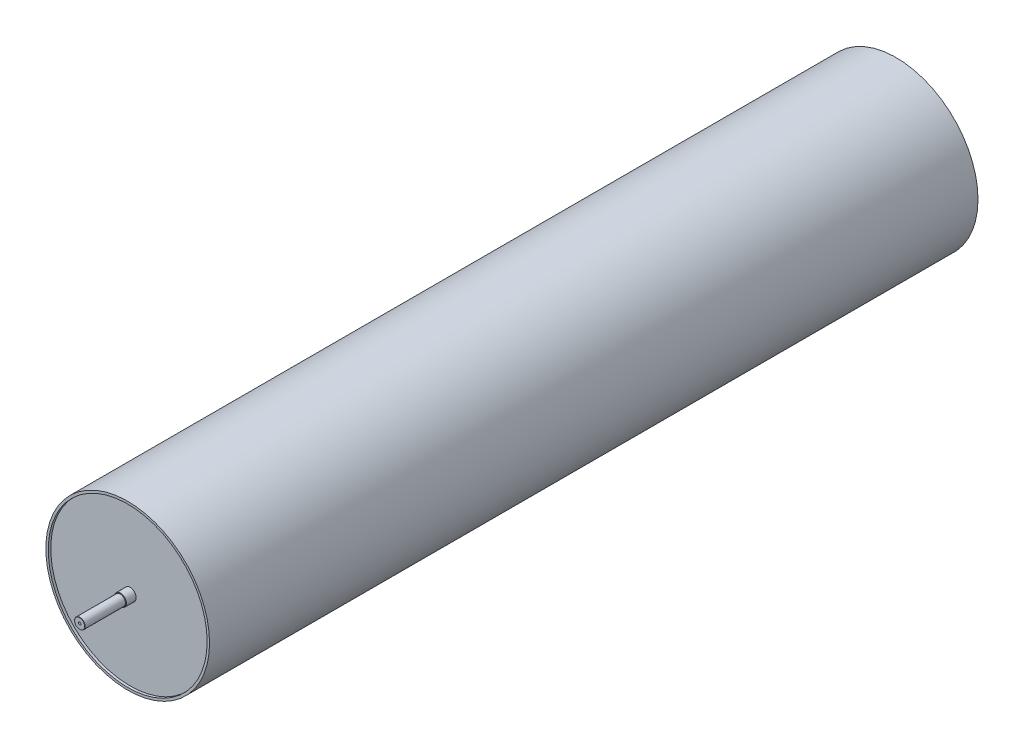
ISO-10303-21;
HEADER;
FILE_DESCRIPTION(('STEP AP214'),'2;1');
FILE_NAME('part.step','',(''),(''),'','','');
FILE_SCHEMA(('AUTOMOTIVE_DESIGN { 1 0 10303 214 1 1 1 1 }'));
ENDSEC;
DATA;
#1=APPLICATION_CONTEXT('core data for automotive mechanical design processes');
#2=APPLICATION_PROTOCOL_DEFINITION('international standard','automotive_design',2000,#1);
#3=PRODUCT_CONTEXT('',#1,'mechanical');
#4=PRODUCT('Part','Part','',(#3));
#5=PRODUCT_RELATED_PRODUCT_CATEGORY('part','',(#4));
#6=PRODUCT_DEFINITION_FORMATION('','',#4);
#7=PRODUCT_DEFINITION_CONTEXT('part definition',#1,'design');
#8=PRODUCT_DEFINITION('design','',#6,#7);
#9=PRODUCT_DEFINITION_SHAPE('','',#8);
#10=(LENGTH_UNIT() NAMED_UNIT(*) SI_UNIT(.MILLI.,.METRE.));
#11=(NAMED_UNIT(*) PLANE_ANGLE_UNIT() SI_UNIT($,.RADIAN.));
#12=(NAMED_UNIT(*) SI_UNIT($,.STERADIAN.) SOLID_ANGLE_UNIT());
#13=UNCERTAINTY_MEASURE_WITH_UNIT(LENGTH_MEASURE(1.E-05),#10,'distance_accuracy_value','');
#14=(GEOMETRIC_REPRESENTATION_CONTEXT(3) GLOBAL_UNCERTAINTY_ASSIGNED_CONTEXT((#13)) GLOBAL_UNIT_ASSIGNED_CONTEXT((#10,
#11,#12)) REPRESENTATION_CONTEXT('',''));
#15=CARTESIAN_POINT('',(0.,0.,0.));
#16=DIRECTION('',(0.,0.,1.));
#17=DIRECTION('',(1.,0.,0.));
#18=AXIS2_PLACEMENT_3D('',#15,#16,#17);
#19=CARTESIAN_POINT('',(0.,0.,767.5));
#20=DIRECTION('',(0.,0.,-1.));
#21=DIRECTION('',(-1.,0.,0.));
#22=AXIS2_PLACEMENT_3D('',#19,#20,#21);
#23=CYLINDRICAL_SURFACE('',#22,158.7);
#24=CARTESIAN_POINT('',(0.,0.,-762.5));
#25=DIRECTION('',(0.,0.,-1.));
#26=DIRECTION('',(-1.,0.,0.));
#27=AXIS2_PLACEMENT_3D('',#24,#25,#26);
#28=CIRCLE('',#27,158.7);
#29=CARTESIAN_POINT('',(-158.7,0.,-762.5));
#30=VERTEX_POINT('',#29);
#31=EDGE_CURVE('E11',#30,#30,#28,.T.);
#32=ORIENTED_EDGE('',*,*,#31,.F.);
#33=EDGE_LOOP('',(#32));
#34=FACE_BOUND('',#33,.T.);
#35=CARTESIAN_POINT('',(0.,0.,-767.5));
#36=DIRECTION('',(0.,0.,1.));
#37=DIRECTION('',(1.,0.,0.));
#38=AXIS2_PLACEMENT_3D('',#35,#36,#37);
#39=CIRCLE('',#38,158.7);
#40=CARTESIAN_POINT('',(158.7,0.,-767.5));
#41=VERTEX_POINT('',#40);
#42=EDGE_CURVE('E95',#41,#41,#39,.T.);
#43=ORIENTED_EDGE('',*,*,#42,.F.);
#44=EDGE_LOOP('',(#43));
#45=FACE_BOUND('',#44,.T.);
#46=ADVANCED_FACE('F39',(#34,#45),#23,.F.);
#47=CARTESIAN_POINT('',(0.,0.,767.5));
#48=DIRECTION('',(0.,0.,1.));
#49=DIRECTION('',(1.,0.,0.));
#50=AXIS2_PLACEMENT_3D('',#47,#48,#49);
#51=PLANE('',#50);
#52=CARTESIAN_POINT('',(0.,0.,767.5));
#53=DIRECTION('',(0.,0.,1.));
#54=DIRECTION('',(1.,0.,0.));
#55=AXIS2_PLACEMENT_3D('',#52,#53,#54);
#56=CIRCLE('',#55,163.5);
#57=CARTESIAN_POINT('',(163.5,0.,767.5));
#58=VERTEX_POINT('',#57);
#59=EDGE_CURVE('E102',#58,#58,#56,.T.);
#60=ORIENTED_EDGE('',*,*,#59,.T.);
#61=EDGE_LOOP('',(#60));
#62=FACE_BOUND('',#61,.T.);
#63=CARTESIAN_POINT('',(0.,0.,767.5));
#64=DIRECTION('',(0.,0.,1.));
#65=DIRECTION('',(1.,0.,0.));
#66=AXIS2_PLACEMENT_3D('',#63,#64,#65);
#67=CIRCLE('',#66,158.7);
#68=CARTESIAN_POINT('',(158.7,0.,767.5));
#69=VERTEX_POINT('',#68);
#70=EDGE_CURVE('E96',#69,#69,#67,.T.);
#71=ORIENTED_EDGE('',*,*,#70,.F.);
#72=EDGE_LOOP('',(#71));
#73=FACE_BOUND('',#72,.T.);
#74=ADVANCED_FACE('F150',(#62,#73),#51,.T.);
#75=CARTESIAN_POINT('',(0.,0.,-767.5));
#76=DIRECTION('',(0.,0.,1.));
#77=DIRECTION('',(1.,0.,0.));
#78=AXIS2_PLACEMENT_3D('',#75,#76,#77);
#79=PLANE('',#78);
#80=CARTESIAN_POINT('',(0.,0.,-767.5));
#81=DIRECTION('',(0.,0.,1.));
#82=DIRECTION('',(1.,0.,0.));
#83=AXIS2_PLACEMENT_3D('',#80,#81,#82);
#84=CIRCLE('',#83,163.5);
#85=CARTESIAN_POINT('',(163.5,0.,-767.5));
#86=VERTEX_POINT('',#85);
#87=EDGE_CURVE('E99',#86,#86,#84,.T.);
#88=ORIENTED_EDGE('',*,*,#87,.F.);
#89=EDGE_LOOP('',(#88));
#90=FACE_BOUND('',#89,.T.);
#91=ORIENTED_EDGE('',*,*,#42,.T.);
#92=EDGE_LOOP('',(#91));
#93=FACE_BOUND('',#92,.T.);
#94=ADVANCED_FACE('F156',(#90,#93),#79,.F.);
#95=CARTESIAN_POINT('',(0.,0.,767.5));
#96=DIRECTION('',(0.,0.,-1.));
#97=DIRECTION('',(-1.,0.,0.));
#98=AXIS2_PLACEMENT_3D('',#95,#96,#97);
#99=CYLINDRICAL_SURFACE('',#98,163.5);
#100=ORIENTED_EDGE('',*,*,#59,.F.);
#101=EDGE_LOOP('',(#100));
#102=FACE_BOUND('',#101,.T.);
#103=ORIENTED_EDGE('',*,*,#87,.T.);
#104=EDGE_LOOP('',(#103));
#105=FACE_BOUND('',#104,.T.);
#106=ADVANCED_FACE('F158',(#102,#105),#99,.T.);
#107=CARTESIAN_POINT('',(0.,0.,762.5));
#108=DIRECTION('',(0.,0.,1.));
#109=DIRECTION('',(1.,0.,0.));
#110=AXIS2_PLACEMENT_3D('',#107,#108,#109);
#111=CIRCLE('',#110,158.7);
#112=CARTESIAN_POINT('',(158.7,0.,762.5));
#113=VERTEX_POINT('',#112);
#114=EDGE_CURVE('E91',#113,#113,#111,.T.);
#115=ORIENTED_EDGE('',*,*,#114,.F.);
#116=EDGE_LOOP('',(#115));
#117=FACE_BOUND('',#116,.T.);
#118=ORIENTED_EDGE('',*,*,#70,.T.);
#119=EDGE_LOOP('',(#118));
#120=FACE_BOUND('',#119,.T.);
#121=ADVANCED_FACE('F152',(#117,#120),#23,.F.);
#122=CARTESIAN_POINT('',(0.,0.,762.5));
#123=DIRECTION('',(0.,0.,1.));
#124=DIRECTION('',(1.,0.,0.));
#125=AXIS2_PLACEMENT_3D('',#122,#123,#124);
#126=PLANE('',#125);
#127=CARTESIAN_POINT('',(0.,-3.32553924873931E-11,762.5));
#128=DIRECTION('',(0.,0.,1.));
#129=DIRECTION('',(1.,0.,0.));
#130=AXIS2_PLACEMENT_3D('',#127,#128,#129);
#131=CIRCLE('',#130,12.0000000000178);
#132=CARTESIAN_POINT('',(12.0000000000178,-3.32553924873931E-11,762.5));
#133=VERTEX_POINT('',#132);
#134=EDGE_CURVE('E86',#133,#133,#131,.F.);
#135=ORIENTED_EDGE('',*,*,#134,.T.);
#136=EDGE_LOOP('',(#135));
#137=FACE_BOUND('',#136,.T.);
#138=ORIENTED_EDGE('',*,*,#114,.T.);
#139=EDGE_LOOP('',(#138));
#140=FACE_BOUND('',#139,.T.);
#141=ADVANCED_FACE('F215',(#137,#140),#126,.T.);
#142=CARTESIAN_POINT('',(0.,-2.13370987545145E-13,863.5));
#143=DIRECTION('',(0.,0.,-1.));
#144=DIRECTION('',(0.,1.,0.));
#145=AXIS2_PLACEMENT_3D('',#142,#143,#144);
#146=PLANE('',#145);
#147=CARTESIAN_POINT('',(0.,-1.91258219579228E-11,863.5));
#148=DIRECTION('',(0.,0.,1.));
#149=DIRECTION('',(1.,0.,0.));
#150=AXIS2_PLACEMENT_3D('',#147,#148,#149);
#151=CIRCLE('',#150,2.49999999999999);
#152=CARTESIAN_POINT('',(2.49999999999999,-1.91258219579228E-11,863.5));
#153=VERTEX_POINT('',#152);
#154=EDGE_CURVE('E74',#153,#153,#151,.T.);
#155=ORIENTED_EDGE('',*,*,#154,.F.);
#156=EDGE_LOOP('',(#155));
#157=FACE_BOUND('',#156,.T.);
#158=CARTESIAN_POINT('',(0.,-3.53078181771131E-11,863.5));
#159=DIRECTION('',(0.,0.,-1.));
#160=DIRECTION('',(0.,1.,0.));
#161=AXIS2_PLACEMENT_3D('',#158,#159,#160);
#162=CIRCLE('',#161,10.0000000000352);
#163=CARTESIAN_POINT('',(0.,9.99999999999984,863.5));
#164=VERTEX_POINT('',#163);
#165=EDGE_CURVE('E116',#164,#164,#162,.F.);
#166=ORIENTED_EDGE('',*,*,#165,.T.);
#167=EDGE_LOOP('',(#166));
#168=FACE_BOUND('',#167,.T.);
#169=ADVANCED_FACE('F209',(#157,#168),#146,.F.);
#170=CARTESIAN_POINT('',(0.,-2.13370987545147E-13,-863.5));
#171=DIRECTION('',(0.,0.,1.));
#172=DIRECTION('',(0.,-1.,0.));
#173=AXIS2_PLACEMENT_3D('',#170,#171,#172);
#174=CYLINDRICAL_SURFACE('',#173,10.5000000000345);
#175=CARTESIAN_POINT('',(0.,-3.52976576538966E-11,863.));
#176=DIRECTION('',(0.,0.,-1.));
#177=DIRECTION('',(0.,1.,0.));
#178=AXIS2_PLACEMENT_3D('',#175,#176,#177);
#179=CIRCLE('',#178,10.5000000000345);
#180=CARTESIAN_POINT('',(0.,10.4999999999992,863.));
#181=VERTEX_POINT('',#180);
#182=EDGE_CURVE('E119',#181,#181,#179,.T.);
#183=ORIENTED_EDGE('',*,*,#182,.T.);
#184=EDGE_LOOP('',(#183));
#185=FACE_BOUND('',#184,.T.);
#186=CARTESIAN_POINT('',(0.,-3.36618134160505E-11,782.5));
#187=DIRECTION('',(0.,0.,1.));
#188=DIRECTION('',(0.,-1.,0.));
#189=AXIS2_PLACEMENT_3D('',#186,#187,#188);
#190=CIRCLE('',#189,10.5000000000337);
#191=CARTESIAN_POINT('',(0.,-10.5000000000673,782.5));
#192=VERTEX_POINT('',#191);
#193=EDGE_CURVE('E80',#192,#192,#190,.T.);
#194=ORIENTED_EDGE('',*,*,#193,.T.);
#195=EDGE_LOOP('',(#194));
#196=FACE_BOUND('',#195,.T.);
#197=ADVANCED_FACE('F204',(#185,#196),#174,.T.);
#198=CARTESIAN_POINT('',(0.,10.5,782.5));
#199=DIRECTION('',(0.,0.,-1.));
#200=DIRECTION('',(0.,1.,0.));
#201=AXIS2_PLACEMENT_3D('',#198,#199,#200);
#202=PLANE('',#201);
#203=CARTESIAN_POINT('',(0.,-3.36618134160505E-11,782.5));
#204=DIRECTION('',(0.,0.,-1.));
#205=DIRECTION('',(0.,1.,0.));
#206=AXIS2_PLACEMENT_3D('',#203,#204,#205);
#207=CIRCLE('',#206,11.5000000000338);
#208=CARTESIAN_POINT('',(0.,11.5000000000001,782.5));
#209=VERTEX_POINT('',#208);
#210=EDGE_CURVE('E122',#209,#209,#207,.F.);
#211=ORIENTED_EDGE('',*,*,#210,.T.);
#212=EDGE_LOOP('',(#211));
#213=FACE_BOUND('',#212,.T.);
#214=ORIENTED_EDGE('',*,*,#193,.F.);
#215=EDGE_LOOP('',(#214));
#216=FACE_BOUND('',#215,.T.);
#217=ADVANCED_FACE('F201',(#213,#216),#202,.F.);
#218=CARTESIAN_POINT('',(0.,-2.13370987545147E-13,-863.5));
#219=DIRECTION('',(0.,0.,1.));
#220=DIRECTION('',(0.,-1.,0.));
#221=AXIS2_PLACEMENT_3D('',#218,#219,#220);
#222=CYLINDRICAL_SURFACE('',#221,12.0000000000178);
#223=CARTESIAN_POINT('',(0.,-3.36516528928344E-11,782.000000000016));
#224=DIRECTION('',(0.,0.,-1.));
#225=DIRECTION('',(0.,1.,0.));
#226=AXIS2_PLACEMENT_3D('',#223,#224,#225);
#227=CIRCLE('',#226,12.0000000000178);
#228=CARTESIAN_POINT('',(0.,11.9999999999841,782.000000000016));
#229=VERTEX_POINT('',#228);
#230=EDGE_CURVE('E125',#229,#229,#227,.T.);
#231=ORIENTED_EDGE('',*,*,#230,.T.);
#232=EDGE_LOOP('',(#231));
#233=FACE_BOUND('',#232,.T.);
#234=ORIENTED_EDGE('',*,*,#134,.F.);
#235=EDGE_LOOP('',(#234));
#236=FACE_BOUND('',#235,.T.);
#237=ADVANCED_FACE('F186',(#233,#236),#222,.T.);
#238=CARTESIAN_POINT('',(0.,-3.53078181771131E-11,863.5));
#239=DIRECTION('',(0.,0.,-1.));
#240=DIRECTION('',(0.,1.,0.));
#241=AXIS2_PLACEMENT_3D('',#238,#239,#240);
#242=CONICAL_SURFACE('',#241,10.000000000035,0.785398163397167);
#243=ORIENTED_EDGE('',*,*,#182,.F.);
#244=EDGE_LOOP('',(#243));
#245=FACE_BOUND('',#244,.T.);
#246=ORIENTED_EDGE('',*,*,#165,.F.);
#247=EDGE_LOOP('',(#246));
#248=FACE_BOUND('',#247,.T.);
#249=ADVANCED_FACE('F180',(#245,#248),#242,.T.);
#250=CARTESIAN_POINT('',(0.,-3.36618134160505E-11,782.5));
#251=DIRECTION('',(0.,0.,-1.));
#252=DIRECTION('',(0.,1.,0.));
#253=AXIS2_PLACEMENT_3D('',#250,#251,#252);
#254=CONICAL_SURFACE('',#253,11.5000000000338,0.785398163397689);
#255=ORIENTED_EDGE('',*,*,#230,.F.);
#256=EDGE_LOOP('',(#255));
#257=FACE_BOUND('',#256,.T.);
#258=ORIENTED_EDGE('',*,*,#210,.F.);
#259=EDGE_LOOP('',(#258));
#260=FACE_BOUND('',#259,.T.);
#261=ADVANCED_FACE('F185',(#257,#260),#254,.T.);
#262=CARTESIAN_POINT('',(0.,-1.91258219579228E-11,848.5));
#263=DIRECTION('',(0.,0.,1.));
#264=DIRECTION('',(1.,0.,0.));
#265=AXIS2_PLACEMENT_3D('',#262,#263,#264);
#266=CONICAL_SURFACE('',#265,2.49999999999999,1.02974425867667);
#267=CARTESIAN_POINT('',(0.,-1.91258219579228E-11,846.997848452431));
#268=VERTEX_POINT('',#267);
#269=VERTEX_LOOP('',#268);
#270=FACE_BOUND('',#269,.T.);
#271=CARTESIAN_POINT('',(0.,-1.91258219579228E-11,848.5));
#272=DIRECTION('',(0.,0.,1.));
#273=DIRECTION('',(1.,0.,0.));
#274=AXIS2_PLACEMENT_3D('',#271,#272,#273);
#275=CIRCLE('',#274,2.49999999999999);
#276=CARTESIAN_POINT('',(2.49999999999999,-1.91258219579228E-11,848.5));
#277=VERTEX_POINT('',#276);
#278=EDGE_CURVE('E77',#277,#277,#275,.T.);
#279=ORIENTED_EDGE('',*,*,#278,.T.);
#280=EDGE_LOOP('',(#279));
#281=FACE_BOUND('',#280,.T.);
#282=ADVANCED_FACE('F191',(#270,#281),#266,.F.);
#283=CARTESIAN_POINT('',(0.,-1.91258219579228E-11,863.5));
#284=DIRECTION('',(0.,0.,1.));
#285=DIRECTION('',(1.,0.,0.));
#286=AXIS2_PLACEMENT_3D('',#283,#284,#285);
#287=CYLINDRICAL_SURFACE('',#286,2.49999999999999);
#288=ORIENTED_EDGE('',*,*,#278,.F.);
#289=EDGE_LOOP('',(#288));
#290=FACE_BOUND('',#289,.T.);
#291=ORIENTED_EDGE('',*,*,#154,.T.);
#292=EDGE_LOOP('',(#291));
#293=FACE_BOUND('',#292,.T.);
#294=ADVANCED_FACE('F144',(#290,#293),#287,.F.);
#295=CARTESIAN_POINT('',(0.,0.,-762.5));
#296=DIRECTION('',(0.,0.,-1.));
#297=DIRECTION('',(1.,0.,0.));
#298=AXIS2_PLACEMENT_3D('',#295,#296,#297);
#299=PLANE('',#298);
#300=CARTESIAN_POINT('',(0.,-2.2657966772651E-12,-762.5));
#301=DIRECTION('',(0.,0.,-1.));
#302=DIRECTION('',(-1.,0.,0.));
#303=AXIS2_PLACEMENT_3D('',#300,#301,#302);
#304=CIRCLE('',#303,12.0000000000178);
#305=CARTESIAN_POINT('',(-12.0000000000178,-2.2657966772651E-12,-762.5));
#306=VERTEX_POINT('',#305);
#307=EDGE_CURVE('E69',#306,#306,#304,.T.);
#308=ORIENTED_EDGE('',*,*,#307,.F.);
#309=EDGE_LOOP('',(#308));
#310=FACE_BOUND('',#309,.T.);
#311=ORIENTED_EDGE('',*,*,#31,.T.);
#312=EDGE_LOOP('',(#311));
#313=FACE_BOUND('',#312,.T.);
#314=ADVANCED_FACE('F140',(#310,#313),#299,.T.);
#315=CARTESIAN_POINT('',(0.,10.5,-863.5));
#316=DIRECTION('',(0.,0.,1.));
#317=DIRECTION('',(0.,-1.,0.));
#318=AXIS2_PLACEMENT_3D('',#315,#316,#317);
#319=PLANE('',#318);
#320=CARTESIAN_POINT('',(0.,-1.91258219579228E-11,-863.5));
#321=DIRECTION('',(0.,0.,-1.));
#322=DIRECTION('',(-1.,0.,0.));
#323=AXIS2_PLACEMENT_3D('',#320,#321,#322);
#324=CIRCLE('',#323,2.49999999999999);
#325=CARTESIAN_POINT('',(-2.49999999999999,-1.91258219579228E-11,-863.5));
#326=VERTEX_POINT('',#325);
#327=EDGE_CURVE('E66',#326,#326,#324,.T.);
#328=ORIENTED_EDGE('',*,*,#327,.F.);
#329=EDGE_LOOP('',(#328));
#330=FACE_BOUND('',#329,.T.);
#331=CARTESIAN_POINT('',(0.,-2.13370987545145E-13,-863.5));
#332=DIRECTION('',(0.,0.,1.));
#333=DIRECTION('',(0.,-1.,0.));
#334=AXIS2_PLACEMENT_3D('',#331,#332,#333);
#335=CIRCLE('',#334,10.0000000000002);
#336=CARTESIAN_POINT('',(0.,-10.0000000000004,-863.5));
#337=VERTEX_POINT('',#336);
#338=EDGE_CURVE('E113',#337,#337,#335,.F.);
#339=ORIENTED_EDGE('',*,*,#338,.T.);
#340=EDGE_LOOP('',(#339));
#341=FACE_BOUND('',#340,.T.);
#342=ADVANCED_FACE('F143',(#330,#341),#319,.F.);
#343=CARTESIAN_POINT('',(0.,-2.23531510761598E-13,-862.999999999999));
#344=DIRECTION('',(0.,0.,1.));
#345=DIRECTION('',(0.,-1.,0.));
#346=AXIS2_PLACEMENT_3D('',#343,#344,#345);
#347=CONICAL_SURFACE('',#346,10.500000000001,0.785398163397438);
#348=ORIENTED_EDGE('',*,*,#338,.F.);
#349=EDGE_LOOP('',(#348));
#350=FACE_BOUND('',#349,.T.);
#351=CARTESIAN_POINT('',(0.,-2.23531510761597E-13,-862.999999999999));
#352=DIRECTION('',(0.,0.,1.));
#353=DIRECTION('',(0.,-1.,0.));
#354=AXIS2_PLACEMENT_3D('',#351,#352,#353);
#355=CIRCLE('',#354,10.500000000001);
#356=CARTESIAN_POINT('',(0.,-10.5000000000013,-862.999999999999));
#357=VERTEX_POINT('',#356);
#358=EDGE_CURVE('E90',#357,#357,#355,.T.);
#359=ORIENTED_EDGE('',*,*,#358,.F.);
#360=EDGE_LOOP('',(#359));
#361=FACE_BOUND('',#360,.T.);
#362=ADVANCED_FACE('F172',(#350,#361),#347,.T.);
#363=CARTESIAN_POINT('',(0.,-2.13370987545147E-13,-863.5));
#364=DIRECTION('',(0.,0.,1.));
#365=DIRECTION('',(0.,-1.,0.));
#366=AXIS2_PLACEMENT_3D('',#363,#364,#365);
#367=CYLINDRICAL_SURFACE('',#366,10.500000000001);
#368=ORIENTED_EDGE('',*,*,#358,.T.);
#369=EDGE_LOOP('',(#368));
#370=FACE_BOUND('',#369,.T.);
#371=CARTESIAN_POINT('',(0.,-1.85937574860768E-12,-782.5));
#372=DIRECTION('',(0.,0.,1.));
#373=DIRECTION('',(0.,-1.,0.));
#374=AXIS2_PLACEMENT_3D('',#371,#372,#373);
#375=CIRCLE('',#374,10.5000000000019);
#376=CARTESIAN_POINT('',(0.,-10.5000000000037,-782.5));
#377=VERTEX_POINT('',#376);
#378=EDGE_CURVE('E83',#377,#377,#375,.T.);
#379=ORIENTED_EDGE('',*,*,#378,.F.);
#380=EDGE_LOOP('',(#379));
#381=FACE_BOUND('',#380,.T.);
#382=ADVANCED_FACE('F178',(#370,#381),#367,.T.);
#383=CARTESIAN_POINT('',(0.,12.,-782.5));
#384=DIRECTION('',(0.,0.,1.));
#385=DIRECTION('',(0.,-1.,0.));
#386=AXIS2_PLACEMENT_3D('',#383,#384,#385);
#387=PLANE('',#386);
#388=CARTESIAN_POINT('',(0.,-1.85937574860768E-12,-782.5));
#389=DIRECTION('',(0.,0.,1.));
#390=DIRECTION('',(0.,-1.,0.));
#391=AXIS2_PLACEMENT_3D('',#388,#389,#390);
#392=CIRCLE('',#391,11.5000000000016);
#393=CARTESIAN_POINT('',(0.,-11.5000000000035,-782.5));
#394=VERTEX_POINT('',#393);
#395=EDGE_CURVE('E131',#394,#394,#392,.F.);
#396=ORIENTED_EDGE('',*,*,#395,.T.);
#397=EDGE_LOOP('',(#396));
#398=FACE_BOUND('',#397,.T.);
#399=ORIENTED_EDGE('',*,*,#378,.T.);
#400=EDGE_LOOP('',(#399));
#401=FACE_BOUND('',#400,.T.);
#402=ADVANCED_FACE('F225',(#398,#401),#387,.F.);
#403=CARTESIAN_POINT('',(0.,-1.86953627182444E-12,-781.999999999984));
#404=DIRECTION('',(0.,0.,1.));
#405=DIRECTION('',(0.,-1.,0.));
#406=AXIS2_PLACEMENT_3D('',#403,#404,#405);
#407=CONICAL_SURFACE('',#406,12.0000000000178,0.785398163397646);
#408=ORIENTED_EDGE('',*,*,#395,.F.);
#409=EDGE_LOOP('',(#408));
#410=FACE_BOUND('',#409,.T.);
#411=CARTESIAN_POINT('',(0.,-1.86953627182444E-12,-781.999999999984));
#412=DIRECTION('',(0.,0.,1.));
#413=DIRECTION('',(0.,-1.,0.));
#414=AXIS2_PLACEMENT_3D('',#411,#412,#413);
#415=CIRCLE('',#414,12.0000000000178);
#416=CARTESIAN_POINT('',(0.,-12.0000000000196,-781.999999999985));
#417=VERTEX_POINT('',#416);
#418=EDGE_CURVE('E128',#417,#417,#415,.T.);
#419=ORIENTED_EDGE('',*,*,#418,.F.);
#420=EDGE_LOOP('',(#419));
#421=FACE_BOUND('',#420,.T.);
#422=ADVANCED_FACE('F42',(#410,#421),#407,.T.);
#423=ORIENTED_EDGE('',*,*,#307,.T.);
#424=EDGE_LOOP('',(#423));
#425=FACE_BOUND('',#424,.T.);
#426=ORIENTED_EDGE('',*,*,#418,.T.);
#427=EDGE_LOOP('',(#426));
#428=FACE_BOUND('',#427,.T.);
#429=ADVANCED_FACE('F59',(#425,#428),#222,.T.);
#430=CARTESIAN_POINT('',(0.,-1.91258219579228E-11,-848.5));
#431=DIRECTION('',(0.,0.,-1.));
#432=DIRECTION('',(-1.,0.,0.));
#433=AXIS2_PLACEMENT_3D('',#430,#431,#432);
#434=CONICAL_SURFACE('',#433,2.49999999999999,1.02974425867667);
#435=CARTESIAN_POINT('',(0.,-1.91258219579228E-11,-846.997848452431));
#436=VERTEX_POINT('',#435);
#437=VERTEX_LOOP('',#436);
#438=FACE_BOUND('',#437,.T.);
#439=CARTESIAN_POINT('',(0.,-1.91258219579228E-11,-848.5));
#440=DIRECTION('',(0.,0.,-1.));
#441=DIRECTION('',(-1.,0.,0.));
#442=AXIS2_PLACEMENT_3D('',#439,#440,#441);
#443=CIRCLE('',#442,2.49999999999999);
#444=CARTESIAN_POINT('',(-2.49999999999999,-1.91258219579228E-11,-848.5));
#445=VERTEX_POINT('',#444);
#446=EDGE_CURVE('E63',#445,#445,#443,.T.);
#447=ORIENTED_EDGE('',*,*,#446,.T.);
#448=EDGE_LOOP('',(#447));
#449=FACE_BOUND('',#448,.T.);
#450=ADVANCED_FACE('F55',(#438,#449),#434,.F.);
#451=CARTESIAN_POINT('',(0.,-1.91258219579228E-11,-863.5));
#452=DIRECTION('',(0.,0.,-1.));
#453=DIRECTION('',(-1.,0.,0.));
#454=AXIS2_PLACEMENT_3D('',#451,#452,#453);
#455=CYLINDRICAL_SURFACE('',#454,2.49999999999999);
#456=ORIENTED_EDGE('',*,*,#446,.F.);
#457=EDGE_LOOP('',(#456));
#458=FACE_BOUND('',#457,.T.);
#459=ORIENTED_EDGE('',*,*,#327,.T.);
#460=EDGE_LOOP('',(#459));
#461=FACE_BOUND('',#460,.T.);
#462=ADVANCED_FACE('F58',(#458,#461),#455,.F.);
#463=CLOSED_SHELL('',(#46,#74,#94,#106,#121,#141,#169,#197,#217,#237,#249,#261,#282,#294,#314,
#342,#362,#382,#402,#422,#429,#450,#462));
#464=CARTESIAN_POINT('',(0.,0.,-757.5));
#465=DIRECTION('',(0.,0.,-1.));
#466=DIRECTION('',(1.,0.,0.));
#467=AXIS2_PLACEMENT_3D('',#464,#465,#466);
#468=PLANE('',#467);
#469=CARTESIAN_POINT('',(0.,-2.36740190942946E-12,-757.5));
#470=DIRECTION('',(0.,0.,-1.));
#471=DIRECTION('',(-1.,0.,0.));
#472=AXIS2_PLACEMENT_3D('',#469,#470,#471);
#473=CIRCLE('',#472,12.0000000000178);
#474=CARTESIAN_POINT('',(-12.0000000000178,-2.36740190942946E-12,-757.5));
#475=VERTEX_POINT('',#474);
#476=EDGE_CURVE('E49',#475,#475,#473,.T.);
#477=ORIENTED_EDGE('',*,*,#476,.T.);
#478=EDGE_LOOP('',(#477));
#479=FACE_BOUND('',#478,.T.);
#480=CARTESIAN_POINT('',(0.,0.,-757.5));
#481=DIRECTION('',(0.,0.,1.));
#482=DIRECTION('',(1.,0.,0.));
#483=AXIS2_PLACEMENT_3D('',#480,#481,#482);
#484=CIRCLE('',#483,158.7);
#485=CARTESIAN_POINT('',(158.7,0.,-757.5));
#486=VERTEX_POINT('',#485);
#487=EDGE_CURVE('E65',#486,#486,#484,.T.);
#488=ORIENTED_EDGE('',*,*,#487,.T.);
#489=EDGE_LOOP('',(#488));
#490=FACE_BOUND('',#489,.T.);
#491=ADVANCED_FACE('F248',(#479,#490),#468,.F.);
#492=CARTESIAN_POINT('',(0.,0.,757.5));
#493=DIRECTION('',(0.,0.,1.));
#494=DIRECTION('',(1.,0.,0.));
#495=AXIS2_PLACEMENT_3D('',#492,#493,#494);
#496=CIRCLE('',#495,158.7);
#497=CARTESIAN_POINT('',(158.7,0.,757.5));
#498=VERTEX_POINT('',#497);
#499=EDGE_CURVE('E92',#498,#498,#496,.T.);
#500=ORIENTED_EDGE('',*,*,#499,.T.);
#501=EDGE_LOOP('',(#500));
#502=FACE_BOUND('',#501,.T.);
#503=ORIENTED_EDGE('',*,*,#487,.F.);
#504=EDGE_LOOP('',(#503));
#505=FACE_BOUND('',#504,.T.);
#506=ADVANCED_FACE('F153',(#502,#505),#23,.F.);
#507=CARTESIAN_POINT('',(0.,0.,757.5));
#508=DIRECTION('',(0.,0.,1.));
#509=DIRECTION('',(1.,0.,0.));
#510=AXIS2_PLACEMENT_3D('',#507,#508,#509);
#511=PLANE('',#510);
#512=CARTESIAN_POINT('',(0.,-3.31537872552288E-11,757.5));
#513=DIRECTION('',(0.,0.,1.));
#514=DIRECTION('',(1.,0.,0.));
#515=AXIS2_PLACEMENT_3D('',#512,#513,#514);
#516=CIRCLE('',#515,12.0000000000178);
#517=CARTESIAN_POINT('',(12.0000000000178,-3.31537872552288E-11,757.5));
#518=VERTEX_POINT('',#517);
#519=EDGE_CURVE('E87',#518,#518,#516,.F.);
#520=ORIENTED_EDGE('',*,*,#519,.F.);
#521=EDGE_LOOP('',(#520));
#522=FACE_BOUND('',#521,.T.);
#523=ORIENTED_EDGE('',*,*,#499,.F.);
#524=EDGE_LOOP('',(#523));
#525=FACE_BOUND('',#524,.T.);
#526=ADVANCED_FACE('F237',(#522,#525),#511,.F.);
#527=ORIENTED_EDGE('',*,*,#519,.T.);
#528=EDGE_LOOP('',(#527));
#529=FACE_BOUND('',#528,.T.);
#530=ORIENTED_EDGE('',*,*,#476,.F.);
#531=EDGE_LOOP('',(#530));
#532=FACE_BOUND('',#531,.T.);
#533=ADVANCED_FACE('F232',(#529,#532),#222,.T.);
#534=CLOSED_SHELL('',(#491,#506,#526,#533));
#535=ORIENTED_CLOSED_SHELL('',*,#534,.T.);
#536=BREP_WITH_VOIDS('B2',#463,(#535));
#537=ADVANCED_BREP_SHAPE_REPRESENTATION('',(#18,#536),#14);
#538=SHAPE_DEFINITION_REPRESENTATION(#9,#537);
ENDSEC;
END-ISO-10303-21;
